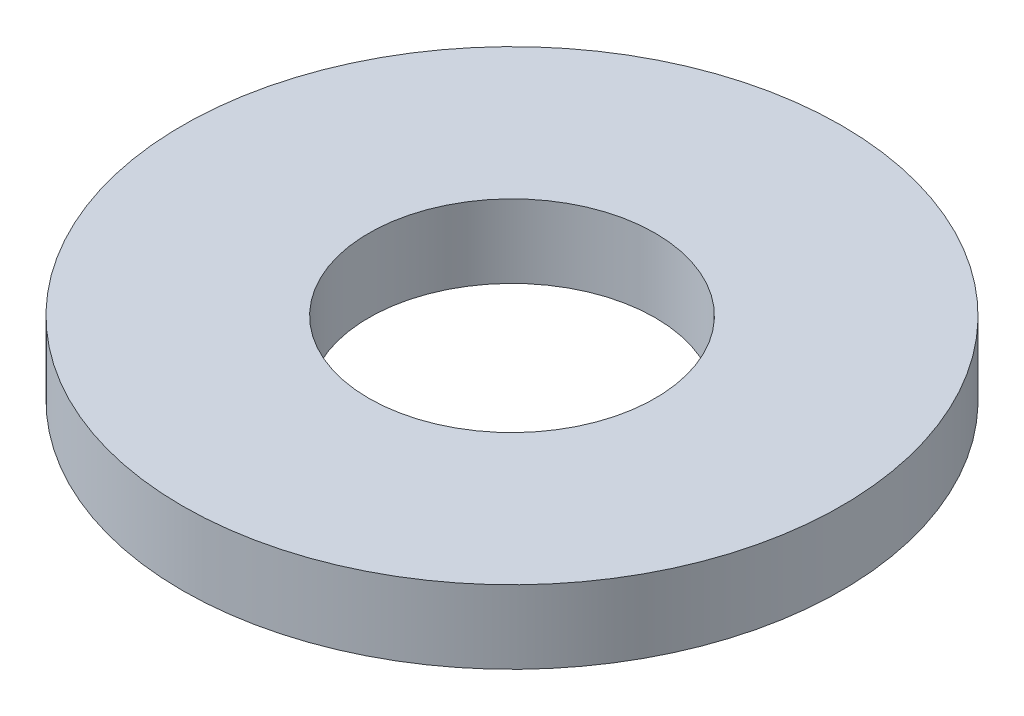
ISO-10303-21;
HEADER;
FILE_DESCRIPTION(('STEP AP214'),'2;1');
FILE_NAME('part.step','',(''),(''),'','','');
FILE_SCHEMA(('AUTOMOTIVE_DESIGN { 1 0 10303 214 1 1 1 1 }'));
ENDSEC;
DATA;
#1=APPLICATION_CONTEXT('core data for automotive mechanical design processes');
#2=APPLICATION_PROTOCOL_DEFINITION('international standard','automotive_design',2000,#1);
#3=PRODUCT_CONTEXT('',#1,'mechanical');
#4=PRODUCT('Part','Part','',(#3));
#5=PRODUCT_RELATED_PRODUCT_CATEGORY('part','',(#4));
#6=PRODUCT_DEFINITION_FORMATION('','',#4);
#7=PRODUCT_DEFINITION_CONTEXT('part definition',#1,'design');
#8=PRODUCT_DEFINITION('design','',#6,#7);
#9=PRODUCT_DEFINITION_SHAPE('','',#8);
#10=(LENGTH_UNIT() NAMED_UNIT(*) SI_UNIT(.MILLI.,.METRE.));
#11=(NAMED_UNIT(*) PLANE_ANGLE_UNIT() SI_UNIT($,.RADIAN.));
#12=(NAMED_UNIT(*) SI_UNIT($,.STERADIAN.) SOLID_ANGLE_UNIT());
#13=UNCERTAINTY_MEASURE_WITH_UNIT(LENGTH_MEASURE(1.E-05),#10,'distance_accuracy_value','');
#14=(GEOMETRIC_REPRESENTATION_CONTEXT(3) GLOBAL_UNCERTAINTY_ASSIGNED_CONTEXT((#13)) GLOBAL_UNIT_ASSIGNED_CONTEXT((#10,
#11,#12)) REPRESENTATION_CONTEXT('',''));
#15=CARTESIAN_POINT('',(0.,0.,0.));
#16=DIRECTION('',(0.,0.,1.));
#17=DIRECTION('',(1.,0.,0.));
#18=AXIS2_PLACEMENT_3D('',#15,#16,#17);
#19=CARTESIAN_POINT('',(0.,5.5,0.));
#20=DIRECTION('',(0.,-1.,0.));
#21=DIRECTION('',(0.,0.,-1.));
#22=AXIS2_PLACEMENT_3D('',#19,#20,#21);
#23=CYLINDRICAL_SURFACE('',#22,24.75);
#24=CARTESIAN_POINT('',(0.,5.5,0.));
#25=DIRECTION('',(0.,1.,0.));
#26=DIRECTION('',(0.,0.,1.));
#27=AXIS2_PLACEMENT_3D('',#24,#25,#26);
#28=CIRCLE('',#27,24.75);
#29=CARTESIAN_POINT('',(0.,5.5,24.75));
#30=VERTEX_POINT('',#29);
#31=EDGE_CURVE('E10',#30,#30,#28,.T.);
#32=ORIENTED_EDGE('',*,*,#31,.F.);
#33=EDGE_LOOP('',(#32));
#34=FACE_BOUND('',#33,.T.);
#35=CARTESIAN_POINT('',(0.,0.,0.));
#36=DIRECTION('',(0.,1.,0.));
#37=DIRECTION('',(0.,0.,1.));
#38=AXIS2_PLACEMENT_3D('',#35,#36,#37);
#39=CIRCLE('',#38,24.75);
#40=CARTESIAN_POINT('',(0.,0.,24.75));
#41=VERTEX_POINT('',#40);
#42=EDGE_CURVE('E34',#41,#41,#39,.T.);
#43=ORIENTED_EDGE('',*,*,#42,.T.);
#44=EDGE_LOOP('',(#43));
#45=FACE_BOUND('',#44,.T.);
#46=ADVANCED_FACE('F31',(#34,#45),#23,.T.);
#47=CARTESIAN_POINT('',(0.,5.5,0.));
#48=DIRECTION('',(0.,1.,0.));
#49=DIRECTION('',(0.,0.,1.));
#50=AXIS2_PLACEMENT_3D('',#47,#48,#49);
#51=PLANE('',#50);
#52=CARTESIAN_POINT('',(0.,5.5,0.));
#53=DIRECTION('',(0.,1.,0.));
#54=DIRECTION('',(0.,0.,1.));
#55=AXIS2_PLACEMENT_3D('',#52,#53,#54);
#56=CIRCLE('',#55,10.75);
#57=CARTESIAN_POINT('',(0.,5.5,10.75));
#58=VERTEX_POINT('',#57);
#59=EDGE_CURVE('E45',#58,#58,#56,.T.);
#60=ORIENTED_EDGE('',*,*,#59,.F.);
#61=EDGE_LOOP('',(#60));
#62=FACE_BOUND('',#61,.T.);
#63=ORIENTED_EDGE('',*,*,#31,.T.);
#64=EDGE_LOOP('',(#63));
#65=FACE_BOUND('',#64,.T.);
#66=ADVANCED_FACE('F52',(#62,#65),#51,.T.);
#67=CARTESIAN_POINT('',(0.,0.,0.));
#68=DIRECTION('',(0.,1.,0.));
#69=DIRECTION('',(0.,0.,1.));
#70=AXIS2_PLACEMENT_3D('',#67,#68,#69);
#71=PLANE('',#70);
#72=CARTESIAN_POINT('',(0.,0.,0.));
#73=DIRECTION('',(0.,1.,0.));
#74=DIRECTION('',(0.,0.,1.));
#75=AXIS2_PLACEMENT_3D('',#72,#73,#74);
#76=CIRCLE('',#75,10.75);
#77=CARTESIAN_POINT('',(0.,0.,10.75));
#78=VERTEX_POINT('',#77);
#79=EDGE_CURVE('E41',#78,#78,#76,.F.);
#80=ORIENTED_EDGE('',*,*,#79,.F.);
#81=EDGE_LOOP('',(#80));
#82=FACE_BOUND('',#81,.T.);
#83=ORIENTED_EDGE('',*,*,#42,.F.);
#84=EDGE_LOOP('',(#83));
#85=FACE_BOUND('',#84,.T.);
#86=ADVANCED_FACE('F54',(#82,#85),#71,.F.);
#87=CARTESIAN_POINT('',(0.,-0.00100000000000013,0.));
#88=DIRECTION('',(0.,1.,0.));
#89=DIRECTION('',(0.,0.,1.));
#90=AXIS2_PLACEMENT_3D('',#87,#88,#89);
#91=CYLINDRICAL_SURFACE('',#90,10.75);
#92=CARTESIAN_POINT('',(0.,5.5,10.75));
#93=CARTESIAN_POINT('',(0.,5.44270833333333,10.75));
#94=CARTESIAN_POINT('',(0.,5.38541666666667,10.75));
#95=CARTESIAN_POINT('',(0.,5.27083333333333,10.75));
#96=CARTESIAN_POINT('',(0.,5.21354166666667,10.75));
#97=CARTESIAN_POINT('',(0.,5.09895833333333,10.75));
#98=CARTESIAN_POINT('',(0.,5.04166666666667,10.75));
#99=CARTESIAN_POINT('',(0.,4.92708333333333,10.75));
#100=CARTESIAN_POINT('',(0.,4.86979166666667,10.75));
#101=CARTESIAN_POINT('',(0.,4.75520833333333,10.75));
#102=CARTESIAN_POINT('',(0.,4.69791666666667,10.75));
#103=CARTESIAN_POINT('',(0.,4.58333333333333,10.75));
#104=CARTESIAN_POINT('',(0.,4.52604166666667,10.75));
#105=CARTESIAN_POINT('',(0.,4.41145833333333,10.75));
#106=CARTESIAN_POINT('',(0.,4.35416666666667,10.75));
#107=CARTESIAN_POINT('',(0.,4.23958333333333,10.75));
#108=CARTESIAN_POINT('',(0.,4.18229166666667,10.75));
#109=CARTESIAN_POINT('',(0.,4.06770833333333,10.75));
#110=CARTESIAN_POINT('',(0.,4.01041666666667,10.75));
#111=CARTESIAN_POINT('',(0.,3.89583333333333,10.75));
#112=CARTESIAN_POINT('',(0.,3.83854166666667,10.75));
#113=CARTESIAN_POINT('',(0.,3.72395833333333,10.75));
#114=CARTESIAN_POINT('',(0.,3.66666666666667,10.75));
#115=CARTESIAN_POINT('',(0.,3.55208333333333,10.75));
#116=CARTESIAN_POINT('',(0.,3.49479166666667,10.75));
#117=CARTESIAN_POINT('',(0.,3.38020833333333,10.75));
#118=CARTESIAN_POINT('',(0.,3.32291666666667,10.75));
#119=CARTESIAN_POINT('',(0.,3.20833333333333,10.75));
#120=CARTESIAN_POINT('',(0.,3.15104166666667,10.75));
#121=CARTESIAN_POINT('',(0.,3.03645833333333,10.75));
#122=CARTESIAN_POINT('',(0.,2.97916666666667,10.75));
#123=CARTESIAN_POINT('',(0.,2.86458333333333,10.75));
#124=CARTESIAN_POINT('',(0.,2.80729166666667,10.75));
#125=CARTESIAN_POINT('',(0.,2.69270833333333,10.75));
#126=CARTESIAN_POINT('',(0.,2.63541666666667,10.75));
#127=CARTESIAN_POINT('',(0.,2.52083333333333,10.75));
#128=CARTESIAN_POINT('',(0.,2.46354166666667,10.75));
#129=CARTESIAN_POINT('',(0.,2.34895833333333,10.75));
#130=CARTESIAN_POINT('',(0.,2.29166666666667,10.75));
#131=CARTESIAN_POINT('',(0.,2.17708333333333,10.75));
#132=CARTESIAN_POINT('',(0.,2.11979166666667,10.75));
#133=CARTESIAN_POINT('',(0.,2.00520833333333,10.75));
#134=CARTESIAN_POINT('',(0.,1.94791666666667,10.75));
#135=CARTESIAN_POINT('',(0.,1.83333333333333,10.75));
#136=CARTESIAN_POINT('',(0.,1.77604166666667,10.75));
#137=CARTESIAN_POINT('',(0.,1.66145833333333,10.75));
#138=CARTESIAN_POINT('',(0.,1.60416666666667,10.75));
#139=CARTESIAN_POINT('',(0.,1.48958333333333,10.75));
#140=CARTESIAN_POINT('',(0.,1.43229166666667,10.75));
#141=CARTESIAN_POINT('',(0.,1.31770833333333,10.75));
#142=CARTESIAN_POINT('',(0.,1.26041666666667,10.75));
#143=CARTESIAN_POINT('',(0.,1.14583333333333,10.75));
#144=CARTESIAN_POINT('',(0.,1.08854166666667,10.75));
#145=CARTESIAN_POINT('',(0.,0.973958333333333,10.75));
#146=CARTESIAN_POINT('',(0.,0.916666666666666,10.75));
#147=CARTESIAN_POINT('',(0.,0.802083333333333,10.75));
#148=CARTESIAN_POINT('',(0.,0.744791666666666,10.75));
#149=CARTESIAN_POINT('',(0.,0.630208333333333,10.75));
#150=CARTESIAN_POINT('',(0.,0.572916666666667,10.75));
#151=CARTESIAN_POINT('',(0.,0.458333333333334,10.75));
#152=CARTESIAN_POINT('',(0.,0.401041666666667,10.75));
#153=CARTESIAN_POINT('',(0.,0.286458333333334,10.75));
#154=CARTESIAN_POINT('',(0.,0.229166666666667,10.75));
#155=CARTESIAN_POINT('',(0.,0.114583333333333,10.75));
#156=CARTESIAN_POINT('',(0.,0.0572916666666668,10.75));
#157=CARTESIAN_POINT('',(0.,0.,10.75));
#158=B_SPLINE_CURVE_WITH_KNOTS('',3,(#92,#93,#94,#95,#96,#97,#98,#99,#100,#101,#102,#103,#104,
#105,#106,#107,#108,#109,#110,#111,#112,#113,#114,#115,#116,#117,#118,#119,#120,#121,#122,#123,
#124,#125,#126,#127,#128,#129,#130,#131,#132,#133,#134,#135,#136,#137,#138,#139,#140,#141,#142,
#143,#144,#145,#146,#147,#148,#149,#150,#151,#152,#153,#154,#155,#156,#157),.UNSPECIFIED.,.F.,
.F.,(4,2,2,2,2,2,2,2,2,2,2,2,2,2,2,2,2,2,2,2,2,2,2,2,2,2,2,2,2,2,2,2,4),(0.,0.171875,0.34375,
0.515625,0.6875,0.859375,1.03125,1.203125,1.375,1.546875,1.71875,1.890625,2.0625,2.234375,
2.40625,2.578125,2.75,2.921875,3.09375,3.265625,3.4375,3.609375,3.78125,3.953125,4.125,4.296875,
4.46875,4.640625,4.8125,4.984375,5.15625,5.328125,5.5),.UNSPECIFIED.);
#159=EDGE_CURVE('BSEAM49',#58,#78,#158,.T.);
#160=ORIENTED_EDGE('',*,*,#59,.T.);
#161=ORIENTED_EDGE('',*,*,#79,.T.);
#162=ORIENTED_EDGE('',*,*,#159,.T.);
#163=ORIENTED_EDGE('',*,*,#159,.F.);
#164=EDGE_LOOP('',(#160,#162,#161,#163));
#165=FACE_BOUND('',#164,.T.);
#166=ADVANCED_FACE('F49',(#165),#91,.F.);
#167=CLOSED_SHELL('',(#46,#66,#86,#166));
#168=MANIFOLD_SOLID_BREP('B2',#167);
#169=ADVANCED_BREP_SHAPE_REPRESENTATION('',(#18,#168),#14);
#170=SHAPE_DEFINITION_REPRESENTATION(#9,#169);
ENDSEC;
END-ISO-10303-21;
